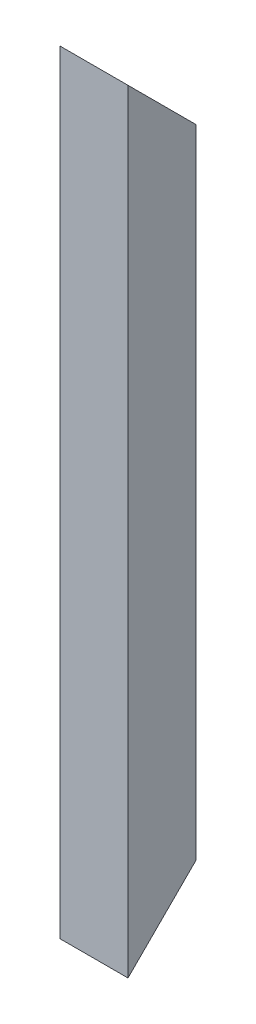
ISO-10303-21;
HEADER;
FILE_DESCRIPTION(('STEP AP214'),'2;1');
FILE_NAME('part.step','',(''),(''),'','','');
FILE_SCHEMA(('AUTOMOTIVE_DESIGN { 1 0 10303 214 1 1 1 1 }'));
ENDSEC;
DATA;
#1=APPLICATION_CONTEXT('core data for automotive mechanical design processes');
#2=APPLICATION_PROTOCOL_DEFINITION('international standard','automotive_design',2000,#1);
#3=PRODUCT_CONTEXT('',#1,'mechanical');
#4=PRODUCT('Part','Part','',(#3));
#5=PRODUCT_RELATED_PRODUCT_CATEGORY('part','',(#4));
#6=PRODUCT_DEFINITION_FORMATION('','',#4);
#7=PRODUCT_DEFINITION_CONTEXT('part definition',#1,'design');
#8=PRODUCT_DEFINITION('design','',#6,#7);
#9=PRODUCT_DEFINITION_SHAPE('','',#8);
#10=(LENGTH_UNIT() NAMED_UNIT(*) SI_UNIT(.MILLI.,.METRE.));
#11=(NAMED_UNIT(*) PLANE_ANGLE_UNIT() SI_UNIT($,.RADIAN.));
#12=(NAMED_UNIT(*) SI_UNIT($,.STERADIAN.) SOLID_ANGLE_UNIT());
#13=UNCERTAINTY_MEASURE_WITH_UNIT(LENGTH_MEASURE(1.E-05),#10,'distance_accuracy_value','');
#14=(GEOMETRIC_REPRESENTATION_CONTEXT(3) GLOBAL_UNCERTAINTY_ASSIGNED_CONTEXT((#13)) GLOBAL_UNIT_ASSIGNED_CONTEXT((#10,
#11,#12)) REPRESENTATION_CONTEXT('',''));
#15=CARTESIAN_POINT('',(0.,0.,0.));
#16=DIRECTION('',(0.,0.,1.));
#17=DIRECTION('',(1.,0.,0.));
#18=AXIS2_PLACEMENT_3D('',#15,#16,#17);
#19=CARTESIAN_POINT('',(22.,250.,0.));
#20=DIRECTION('',(0.,0.,-1.));
#21=DIRECTION('',(-1.,0.,0.));
#22=AXIS2_PLACEMENT_3D('',#19,#20,#21);
#23=PLANE('',#22);
#24=DIRECTION('',(1.,0.,0.));
#25=VECTOR('',#24,1.);
#26=CARTESIAN_POINT('',(22.,0.,0.));
#27=LINE('',#26,#25);
#28=CARTESIAN_POINT('',(0.,0.,0.));
#29=VERTEX_POINT('',#28);
#30=CARTESIAN_POINT('',(22.,0.,0.));
#31=VERTEX_POINT('',#30);
#32=EDGE_CURVE('E128',#29,#31,#27,.T.);
#33=ORIENTED_EDGE('',*,*,#32,.T.);
#34=DIRECTION('',(0.,-1.,0.));
#35=VECTOR('',#34,1.);
#36=CARTESIAN_POINT('',(22.,250.,0.));
#37=LINE('',#36,#35);
#38=CARTESIAN_POINT('',(22.,250.,0.));
#39=VERTEX_POINT('',#38);
#40=EDGE_CURVE('E11',#39,#31,#37,.T.);
#41=ORIENTED_EDGE('',*,*,#40,.F.);
#42=DIRECTION('',(1.,0.,0.));
#43=VECTOR('',#42,1.);
#44=CARTESIAN_POINT('',(22.,250.,0.));
#45=LINE('',#44,#43);
#46=CARTESIAN_POINT('',(0.,250.,0.));
#47=VERTEX_POINT('',#46);
#48=EDGE_CURVE('E127',#47,#39,#45,.T.);
#49=ORIENTED_EDGE('',*,*,#48,.F.);
#50=DIRECTION('',(0.,-1.,0.));
#51=VECTOR('',#50,1.);
#52=CARTESIAN_POINT('',(0.,250.,0.));
#53=LINE('',#52,#51);
#54=EDGE_CURVE('E123',#47,#29,#53,.T.);
#55=ORIENTED_EDGE('',*,*,#54,.T.);
#56=EDGE_LOOP('',(#33,#41,#49,#55));
#57=FACE_BOUND('',#56,.T.);
#58=ADVANCED_FACE('F38',(#57),#23,.F.);
#59=CARTESIAN_POINT('',(22.,250.,-22.));
#60=DIRECTION('',(-1.,0.,0.));
#61=DIRECTION('',(0.,0.,1.));
#62=AXIS2_PLACEMENT_3D('',#59,#60,#61);
#63=PLANE('',#62);
#64=ORIENTED_EDGE('',*,*,#40,.T.);
#65=DIRECTION('',(0.,-0.707106781186544,0.707106781186551));
#66=VECTOR('',#65,1.);
#67=CARTESIAN_POINT('',(22.,21.9999999999998,-22.));
#68=LINE('',#67,#66);
#69=CARTESIAN_POINT('',(22.,21.9999999999998,-22.));
#70=VERTEX_POINT('',#69);
#71=EDGE_CURVE('E89',#70,#31,#68,.T.);
#72=ORIENTED_EDGE('',*,*,#71,.F.);
#73=DIRECTION('',(0.,-1.,0.));
#74=VECTOR('',#73,1.);
#75=CARTESIAN_POINT('',(22.,250.,-22.));
#76=LINE('',#75,#74);
#77=CARTESIAN_POINT('',(22.,228.,-22.));
#78=VERTEX_POINT('',#77);
#79=EDGE_CURVE('E47',#78,#70,#76,.T.);
#80=ORIENTED_EDGE('',*,*,#79,.F.);
#81=DIRECTION('',(0.,-0.707106781186551,-0.707106781186544));
#82=VECTOR('',#81,1.);
#83=CARTESIAN_POINT('',(22.,228.,-22.));
#84=LINE('',#83,#82);
#85=EDGE_CURVE('E154',#39,#78,#84,.T.);
#86=ORIENTED_EDGE('',*,*,#85,.F.);
#87=EDGE_LOOP('',(#64,#72,#80,#86));
#88=FACE_BOUND('',#87,.T.);
#89=ADVANCED_FACE('F101',(#88),#63,.F.);
#90=CARTESIAN_POINT('',(20.,250.,-22.));
#91=DIRECTION('',(0.,0.,1.));
#92=DIRECTION('',(1.,0.,0.));
#93=AXIS2_PLACEMENT_3D('',#90,#91,#92);
#94=PLANE('',#93);
#95=ORIENTED_EDGE('',*,*,#79,.T.);
#96=DIRECTION('',(1.,0.,0.));
#97=VECTOR('',#96,1.);
#98=CARTESIAN_POINT('',(-228.,21.9999999999998,-22.));
#99=LINE('',#98,#97);
#100=CARTESIAN_POINT('',(20.,21.9999999999998,-22.));
#101=VERTEX_POINT('',#100);
#102=EDGE_CURVE('E86',#101,#70,#99,.T.);
#103=ORIENTED_EDGE('',*,*,#102,.F.);
#104=DIRECTION('',(0.,-1.,0.));
#105=VECTOR('',#104,1.);
#106=CARTESIAN_POINT('',(20.,250.,-22.));
#107=LINE('',#106,#105);
#108=CARTESIAN_POINT('',(20.,228.,-22.));
#109=VERTEX_POINT('',#108);
#110=EDGE_CURVE('E111',#109,#101,#107,.T.);
#111=ORIENTED_EDGE('',*,*,#110,.F.);
#112=DIRECTION('',(1.,0.,0.));
#113=VECTOR('',#112,1.);
#114=CARTESIAN_POINT('',(-228.,228.,-22.));
#115=LINE('',#114,#113);
#116=EDGE_CURVE('E106',#109,#78,#115,.T.);
#117=ORIENTED_EDGE('',*,*,#116,.T.);
#118=EDGE_LOOP('',(#95,#103,#111,#117));
#119=FACE_BOUND('',#118,.T.);
#120=ADVANCED_FACE('F109',(#119),#94,.F.);
#121=CARTESIAN_POINT('',(20.,250.,-2.));
#122=DIRECTION('',(1.,0.,0.));
#123=DIRECTION('',(0.,0.,-1.));
#124=AXIS2_PLACEMENT_3D('',#121,#122,#123);
#125=PLANE('',#124);
#126=ORIENTED_EDGE('',*,*,#110,.T.);
#127=DIRECTION('',(0.,-0.707106781186544,0.707106781186551));
#128=VECTOR('',#127,1.);
#129=CARTESIAN_POINT('',(20.,125.999999999999,-126.));
#130=LINE('',#129,#128);
#131=CARTESIAN_POINT('',(20.,1.99999999999998,-2.));
#132=VERTEX_POINT('',#131);
#133=EDGE_CURVE('E91',#101,#132,#130,.T.);
#134=ORIENTED_EDGE('',*,*,#133,.T.);
#135=DIRECTION('',(0.,-1.,0.));
#136=VECTOR('',#135,1.);
#137=CARTESIAN_POINT('',(20.,250.,-2.));
#138=LINE('',#137,#136);
#139=CARTESIAN_POINT('',(20.,248.,-2.));
#140=VERTEX_POINT('',#139);
#141=EDGE_CURVE('E113',#140,#132,#138,.T.);
#142=ORIENTED_EDGE('',*,*,#141,.F.);
#143=DIRECTION('',(0.,-0.707106781186551,-0.707106781186544));
#144=VECTOR('',#143,1.);
#145=CARTESIAN_POINT('',(20.,249.,-0.999999999999987));
#146=LINE('',#145,#144);
#147=EDGE_CURVE('E131',#140,#109,#146,.T.);
#148=ORIENTED_EDGE('',*,*,#147,.T.);
#149=EDGE_LOOP('',(#126,#134,#142,#148));
#150=FACE_BOUND('',#149,.T.);
#151=ADVANCED_FACE('F166',(#150),#125,.F.);
#152=CARTESIAN_POINT('',(0.,250.,-2.));
#153=DIRECTION('',(0.,0.,1.));
#154=DIRECTION('',(1.,0.,0.));
#155=AXIS2_PLACEMENT_3D('',#152,#153,#154);
#156=PLANE('',#155);
#157=ORIENTED_EDGE('',*,*,#141,.T.);
#158=DIRECTION('',(-1.,0.,0.));
#159=VECTOR('',#158,1.);
#160=CARTESIAN_POINT('',(0.,1.99999999999997,-2.));
#161=LINE('',#160,#159);
#162=CARTESIAN_POINT('',(0.,1.99999999999993,-1.99999999999999));
#163=VERTEX_POINT('',#162);
#164=EDGE_CURVE('E145',#132,#163,#161,.T.);
#165=ORIENTED_EDGE('',*,*,#164,.T.);
#166=DIRECTION('',(0.,-1.,0.));
#167=VECTOR('',#166,1.);
#168=CARTESIAN_POINT('',(0.,250.,-2.));
#169=LINE('',#168,#167);
#170=CARTESIAN_POINT('',(0.,248.,-2.));
#171=VERTEX_POINT('',#170);
#172=EDGE_CURVE('E119',#171,#163,#169,.T.);
#173=ORIENTED_EDGE('',*,*,#172,.F.);
#174=DIRECTION('',(1.,0.,0.));
#175=VECTOR('',#174,1.);
#176=CARTESIAN_POINT('',(0.,248.,-2.));
#177=LINE('',#176,#175);
#178=EDGE_CURVE('E137',#171,#140,#177,.T.);
#179=ORIENTED_EDGE('',*,*,#178,.T.);
#180=EDGE_LOOP('',(#157,#165,#173,#179));
#181=FACE_BOUND('',#180,.T.);
#182=ADVANCED_FACE('F163',(#181),#156,.F.);
#183=CARTESIAN_POINT('',(0.,250.,0.));
#184=DIRECTION('',(1.,0.,0.));
#185=DIRECTION('',(0.,0.,-1.));
#186=AXIS2_PLACEMENT_3D('',#183,#184,#185);
#187=PLANE('',#186);
#188=ORIENTED_EDGE('',*,*,#172,.T.);
#189=DIRECTION('',(0.,-0.707106781186544,0.707106781186551));
#190=VECTOR('',#189,1.);
#191=CARTESIAN_POINT('',(0.,124.999999999999,-125.));
#192=LINE('',#191,#190);
#193=EDGE_CURVE('E97',#163,#29,#192,.T.);
#194=ORIENTED_EDGE('',*,*,#193,.T.);
#195=ORIENTED_EDGE('',*,*,#54,.F.);
#196=DIRECTION('',(0.,-0.707106781186551,-0.707106781186544));
#197=VECTOR('',#196,1.);
#198=CARTESIAN_POINT('',(0.,250.,0.));
#199=LINE('',#198,#197);
#200=EDGE_CURVE('E53',#47,#171,#199,.T.);
#201=ORIENTED_EDGE('',*,*,#200,.T.);
#202=EDGE_LOOP('',(#188,#194,#195,#201));
#203=FACE_BOUND('',#202,.T.);
#204=ADVANCED_FACE('F160',(#203),#187,.F.);
#205=CARTESIAN_POINT('',(-228.,21.9999999999998,-22.));
#206=DIRECTION('',(0.,0.707106781186551,0.707106781186544));
#207=DIRECTION('',(0.,-0.707106781186544,0.707106781186551));
#208=AXIS2_PLACEMENT_3D('',#205,#206,#207);
#209=PLANE('',#208);
#210=ORIENTED_EDGE('',*,*,#102,.T.);
#211=ORIENTED_EDGE('',*,*,#71,.T.);
#212=ORIENTED_EDGE('',*,*,#32,.F.);
#213=ORIENTED_EDGE('',*,*,#193,.F.);
#214=ORIENTED_EDGE('',*,*,#164,.F.);
#215=ORIENTED_EDGE('',*,*,#133,.F.);
#216=EDGE_LOOP('',(#210,#211,#212,#213,#214,#215));
#217=FACE_BOUND('',#216,.T.);
#218=ADVANCED_FACE('F88',(#217),#209,.F.);
#219=CARTESIAN_POINT('',(-228.,228.,-22.));
#220=DIRECTION('',(0.,-0.707106781186544,0.707106781186551));
#221=DIRECTION('',(0.,-0.707106781186551,-0.707106781186544));
#222=AXIS2_PLACEMENT_3D('',#219,#220,#221);
#223=PLANE('',#222);
#224=ORIENTED_EDGE('',*,*,#178,.F.);
#225=ORIENTED_EDGE('',*,*,#200,.F.);
#226=ORIENTED_EDGE('',*,*,#48,.T.);
#227=ORIENTED_EDGE('',*,*,#85,.T.);
#228=ORIENTED_EDGE('',*,*,#116,.F.);
#229=ORIENTED_EDGE('',*,*,#147,.F.);
#230=EDGE_LOOP('',(#224,#225,#226,#227,#228,#229));
#231=FACE_BOUND('',#230,.T.);
#232=ADVANCED_FACE('F156',(#231),#223,.F.);
#233=CLOSED_SHELL('',(#58,#89,#120,#151,#182,#204,#218,#232));
#234=MANIFOLD_SOLID_BREP('B2',#233);
#235=ADVANCED_BREP_SHAPE_REPRESENTATION('',(#18,#234),#14);
#236=SHAPE_DEFINITION_REPRESENTATION(#9,#235);
ENDSEC;
END-ISO-10303-21;
